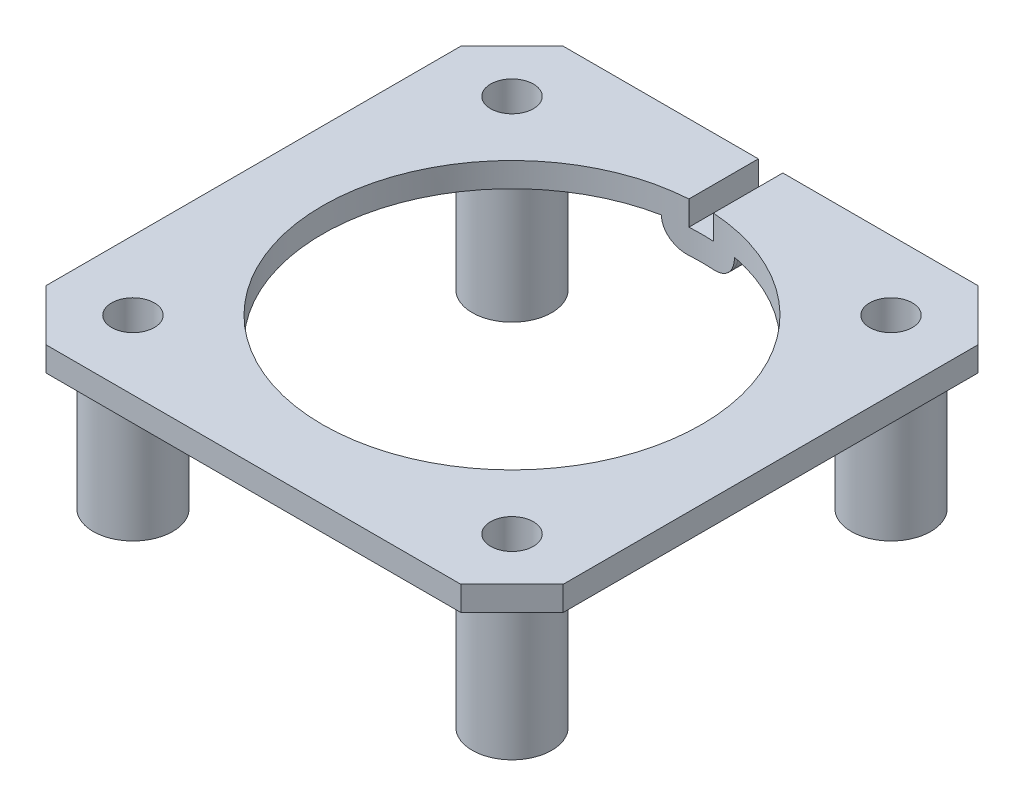
ISO-10303-21;
HEADER;
FILE_DESCRIPTION(('STEP AP214'),'2;1');
FILE_NAME('part.step','',(''),(''),'','','');
FILE_SCHEMA(('AUTOMOTIVE_DESIGN { 1 0 10303 214 1 1 1 1 }'));
ENDSEC;
DATA;
#1=APPLICATION_CONTEXT('core data for automotive mechanical design processes');
#2=APPLICATION_PROTOCOL_DEFINITION('international standard','automotive_design',2000,#1);
#3=PRODUCT_CONTEXT('',#1,'mechanical');
#4=PRODUCT('Part','Part','',(#3));
#5=PRODUCT_RELATED_PRODUCT_CATEGORY('part','',(#4));
#6=PRODUCT_DEFINITION_FORMATION('','',#4);
#7=PRODUCT_DEFINITION_CONTEXT('part definition',#1,'design');
#8=PRODUCT_DEFINITION('design','',#6,#7);
#9=PRODUCT_DEFINITION_SHAPE('','',#8);
#10=(LENGTH_UNIT() NAMED_UNIT(*) SI_UNIT(.MILLI.,.METRE.));
#11=(NAMED_UNIT(*) PLANE_ANGLE_UNIT() SI_UNIT($,.RADIAN.));
#12=(NAMED_UNIT(*) SI_UNIT($,.STERADIAN.) SOLID_ANGLE_UNIT());
#13=UNCERTAINTY_MEASURE_WITH_UNIT(LENGTH_MEASURE(1.E-05),#10,'distance_accuracy_value','');
#14=(GEOMETRIC_REPRESENTATION_CONTEXT(3) GLOBAL_UNCERTAINTY_ASSIGNED_CONTEXT((#13)) GLOBAL_UNIT_ASSIGNED_CONTEXT((#10,
#11,#12)) REPRESENTATION_CONTEXT('',''));
#15=CARTESIAN_POINT('',(0.,0.,0.));
#16=DIRECTION('',(0.,0.,1.));
#17=DIRECTION('',(1.,0.,0.));
#18=AXIS2_PLACEMENT_3D('',#15,#16,#17);
#19=CARTESIAN_POINT('',(0.,11.7,0.));
#20=DIRECTION('',(0.,1.,0.));
#21=DIRECTION('',(0.,0.,1.));
#22=AXIS2_PLACEMENT_3D('',#19,#20,#21);
#23=PLANE('',#22);
#24=CARTESIAN_POINT('',(-15.5,11.7,-15.5));
#25=DIRECTION('',(0.,1.,0.));
#26=DIRECTION('',(0.,0.,1.));
#27=AXIS2_PLACEMENT_3D('',#24,#25,#26);
#28=CIRCLE('',#27,3.25);
#29=CARTESIAN_POINT('',(-15.5,11.7,-12.25));
#30=VERTEX_POINT('',#29);
#31=EDGE_CURVE('E372',#30,#30,#28,.T.);
#32=ORIENTED_EDGE('',*,*,#31,.T.);
#33=EDGE_LOOP('',(#32));
#34=FACE_BOUND('',#33,.T.);
#35=CARTESIAN_POINT('',(15.5,11.7,-15.5));
#36=DIRECTION('',(0.,1.,0.));
#37=DIRECTION('',(0.,0.,1.));
#38=AXIS2_PLACEMENT_3D('',#35,#36,#37);
#39=CIRCLE('',#38,3.25);
#40=CARTESIAN_POINT('',(15.5,11.7,-12.25));
#41=VERTEX_POINT('',#40);
#42=EDGE_CURVE('E364',#41,#41,#39,.F.);
#43=ORIENTED_EDGE('',*,*,#42,.F.);
#44=EDGE_LOOP('',(#43));
#45=FACE_BOUND('',#44,.T.);
#46=CARTESIAN_POINT('',(-15.5,11.7,15.5));
#47=DIRECTION('',(0.,1.,0.));
#48=DIRECTION('',(0.,0.,1.));
#49=AXIS2_PLACEMENT_3D('',#46,#47,#48);
#50=CIRCLE('',#49,3.25);
#51=CARTESIAN_POINT('',(-15.5,11.7,18.75));
#52=VERTEX_POINT('',#51);
#53=EDGE_CURVE('E356',#52,#52,#50,.F.);
#54=ORIENTED_EDGE('',*,*,#53,.F.);
#55=EDGE_LOOP('',(#54));
#56=FACE_BOUND('',#55,.T.);
#57=CARTESIAN_POINT('',(15.5,11.7,15.5));
#58=DIRECTION('',(0.,1.,0.));
#59=DIRECTION('',(0.,0.,1.));
#60=AXIS2_PLACEMENT_3D('',#57,#58,#59);
#61=CIRCLE('',#60,3.25);
#62=CARTESIAN_POINT('',(15.5,11.7,18.75));
#63=VERTEX_POINT('',#62);
#64=EDGE_CURVE('E352',#63,#63,#61,.F.);
#65=ORIENTED_EDGE('',*,*,#64,.F.);
#66=EDGE_LOOP('',(#65));
#67=FACE_BOUND('',#66,.T.);
#68=DIRECTION('',(0.,0.,1.));
#69=VECTOR('',#68,1.);
#70=CARTESIAN_POINT('',(2.99999999999999,11.7,-21.15));
#71=LINE('',#70,#69);
#72=CARTESIAN_POINT('',(3.,11.7,-21.15));
#73=VERTEX_POINT('',#72);
#74=CARTESIAN_POINT('',(3.,11.7,-15.5));
#75=VERTEX_POINT('',#74);
#76=EDGE_CURVE('E235',#73,#75,#71,.T.);
#77=ORIENTED_EDGE('',*,*,#76,.F.);
#78=DIRECTION('',(-1.,0.,0.));
#79=VECTOR('',#78,1.);
#80=CARTESIAN_POINT('',(-21.15,11.7,-21.15));
#81=LINE('',#80,#79);
#82=CARTESIAN_POINT('',(16.9630555059549,11.7,-21.15));
#83=VERTEX_POINT('',#82);
#84=EDGE_CURVE('E387',#83,#73,#81,.T.);
#85=ORIENTED_EDGE('',*,*,#84,.F.);
#86=DIRECTION('',(-0.707106781186546,0.,-0.707106781186549));
#87=VECTOR('',#86,1.);
#88=CARTESIAN_POINT('',(19.0565277529775,11.7,-19.0565277529774));
#89=LINE('',#88,#87);
#90=CARTESIAN_POINT('',(21.15,11.7,-16.9630555059549));
#91=VERTEX_POINT('',#90);
#92=EDGE_CURVE('E300',#91,#83,#89,.T.);
#93=ORIENTED_EDGE('',*,*,#92,.F.);
#94=DIRECTION('',(0.,0.,-1.));
#95=VECTOR('',#94,1.);
#96=CARTESIAN_POINT('',(21.15,11.7,-21.15));
#97=LINE('',#96,#95);
#98=CARTESIAN_POINT('',(21.15,11.7,16.9630555059549));
#99=VERTEX_POINT('',#98);
#100=EDGE_CURVE('E381',#99,#91,#97,.T.);
#101=ORIENTED_EDGE('',*,*,#100,.F.);
#102=DIRECTION('',(-0.707106781186546,0.,0.707106781186549));
#103=VECTOR('',#102,1.);
#104=CARTESIAN_POINT('',(19.0565277529775,11.7,19.0565277529774));
#105=LINE('',#104,#103);
#106=CARTESIAN_POINT('',(16.9630555059549,11.7,21.15));
#107=VERTEX_POINT('',#106);
#108=EDGE_CURVE('E328',#99,#107,#105,.T.);
#109=ORIENTED_EDGE('',*,*,#108,.T.);
#110=DIRECTION('',(1.,0.,0.));
#111=VECTOR('',#110,1.);
#112=CARTESIAN_POINT('',(-21.15,11.7,21.15));
#113=LINE('',#112,#111);
#114=CARTESIAN_POINT('',(-16.9630555059549,11.7,21.15));
#115=VERTEX_POINT('',#114);
#116=EDGE_CURVE('E395',#115,#107,#113,.T.);
#117=ORIENTED_EDGE('',*,*,#116,.F.);
#118=DIRECTION('',(0.707106781186546,0.,0.707106781186549));
#119=VECTOR('',#118,1.);
#120=CARTESIAN_POINT('',(-19.0565277529775,11.7,19.0565277529774));
#121=LINE('',#120,#119);
#122=CARTESIAN_POINT('',(-21.15,11.7,16.9630555059549));
#123=VERTEX_POINT('',#122);
#124=EDGE_CURVE('E314',#123,#115,#121,.T.);
#125=ORIENTED_EDGE('',*,*,#124,.F.);
#126=DIRECTION('',(0.,0.,1.));
#127=VECTOR('',#126,1.);
#128=CARTESIAN_POINT('',(-21.15,11.7,-21.15));
#129=LINE('',#128,#127);
#130=CARTESIAN_POINT('',(-21.15,11.7,-16.9630555059549));
#131=VERTEX_POINT('',#130);
#132=EDGE_CURVE('E391',#131,#123,#129,.T.);
#133=ORIENTED_EDGE('',*,*,#132,.F.);
#134=DIRECTION('',(0.707106781186546,0.,-0.707106781186549));
#135=VECTOR('',#134,1.);
#136=CARTESIAN_POINT('',(-19.0565277529775,11.7,-19.0565277529774));
#137=LINE('',#136,#135);
#138=CARTESIAN_POINT('',(-16.9630555059549,11.7,-21.15));
#139=VERTEX_POINT('',#138);
#140=EDGE_CURVE('E343',#131,#139,#137,.T.);
#141=ORIENTED_EDGE('',*,*,#140,.T.);
#142=CARTESIAN_POINT('',(-3.,11.7,-21.15));
#143=VERTEX_POINT('',#142);
#144=EDGE_CURVE('E385',#143,#139,#81,.T.);
#145=ORIENTED_EDGE('',*,*,#144,.F.);
#146=DIRECTION('',(0.,0.,-1.));
#147=VECTOR('',#146,1.);
#148=CARTESIAN_POINT('',(-3.00000000000001,11.7,-21.15));
#149=LINE('',#148,#147);
#150=CARTESIAN_POINT('',(-3.,11.7,-15.5));
#151=VERTEX_POINT('',#150);
#152=EDGE_CURVE('E240',#151,#143,#149,.T.);
#153=ORIENTED_EDGE('',*,*,#152,.F.);
#154=CARTESIAN_POINT('',(0.,11.7,-15.5));
#155=DIRECTION('',(0.,-1.,0.));
#156=DIRECTION('',(0.,0.,-1.));
#157=AXIS2_PLACEMENT_3D('',#154,#155,#156);
#158=CIRCLE('',#157,3.);
#159=CARTESIAN_POINT('',(-2.98591908784674,11.7,-15.2096774193548));
#160=VERTEX_POINT('',#159);
#161=EDGE_CURVE('E252',#160,#151,#158,.T.);
#162=ORIENTED_EDGE('',*,*,#161,.F.);
#163=CARTESIAN_POINT('',(0.,11.7,0.));
#164=DIRECTION('',(0.,1.,0.));
#165=DIRECTION('',(0.,0.,1.));
#166=AXIS2_PLACEMENT_3D('',#163,#164,#165);
#167=CIRCLE('',#166,15.5);
#168=CARTESIAN_POINT('',(2.98591908784675,11.7,-15.2096774193548));
#169=VERTEX_POINT('',#168);
#170=EDGE_CURVE('E373',#160,#169,#167,.T.);
#171=ORIENTED_EDGE('',*,*,#170,.T.);
#172=CARTESIAN_POINT('',(0.,11.7,-15.5));
#173=DIRECTION('',(0.,-1.,0.));
#174=DIRECTION('',(0.,0.,-1.));
#175=AXIS2_PLACEMENT_3D('',#172,#173,#174);
#176=CIRCLE('',#175,3.);
#177=EDGE_CURVE('E248',#75,#169,#176,.T.);
#178=ORIENTED_EDGE('',*,*,#177,.F.);
#179=EDGE_LOOP('',(#77,#85,#93,#101,#109,#117,#125,#133,#141,#145,#153,#162,#171,#178));
#180=FACE_BOUND('',#179,.T.);
#181=ADVANCED_FACE('F39',(#34,#45,#56,#67,#180),#23,.F.);
#182=CARTESIAN_POINT('',(21.15,11.7,-21.15));
#183=DIRECTION('',(1.,0.,0.));
#184=DIRECTION('',(0.,0.,-1.));
#185=AXIS2_PLACEMENT_3D('',#182,#183,#184);
#186=PLANE('',#185);
#187=ORIENTED_EDGE('',*,*,#100,.T.);
#188=DIRECTION('',(0.,1.,0.));
#189=VECTOR('',#188,1.);
#190=CARTESIAN_POINT('',(21.15,0.,-16.9630555059549));
#191=LINE('',#190,#189);
#192=CARTESIAN_POINT('',(21.15,13.7,-16.9630555059549));
#193=VERTEX_POINT('',#192);
#194=EDGE_CURVE('E295',#91,#193,#191,.T.);
#195=ORIENTED_EDGE('',*,*,#194,.T.);
#196=DIRECTION('',(0.,0.,-1.));
#197=VECTOR('',#196,1.);
#198=CARTESIAN_POINT('',(21.15,13.7,-21.15));
#199=LINE('',#198,#197);
#200=CARTESIAN_POINT('',(21.15,13.7,16.9630555059549));
#201=VERTEX_POINT('',#200);
#202=EDGE_CURVE('E377',#201,#193,#199,.T.);
#203=ORIENTED_EDGE('',*,*,#202,.F.);
#204=DIRECTION('',(0.,1.,0.));
#205=VECTOR('',#204,1.);
#206=CARTESIAN_POINT('',(21.15,0.,16.9630555059549));
#207=LINE('',#206,#205);
#208=EDGE_CURVE('E334',#99,#201,#207,.T.);
#209=ORIENTED_EDGE('',*,*,#208,.F.);
#210=EDGE_LOOP('',(#187,#195,#203,#209));
#211=FACE_BOUND('',#210,.T.);
#212=ADVANCED_FACE('F470',(#211),#186,.T.);
#213=CARTESIAN_POINT('',(-21.15,11.7,21.15));
#214=DIRECTION('',(0.,0.,1.));
#215=DIRECTION('',(1.,0.,0.));
#216=AXIS2_PLACEMENT_3D('',#213,#214,#215);
#217=PLANE('',#216);
#218=DIRECTION('',(1.,0.,0.));
#219=VECTOR('',#218,1.);
#220=CARTESIAN_POINT('',(-21.15,13.7,21.15));
#221=LINE('',#220,#219);
#222=CARTESIAN_POINT('',(-16.9630555059549,13.7,21.15));
#223=VERTEX_POINT('',#222);
#224=CARTESIAN_POINT('',(16.9630555059549,13.7,21.15));
#225=VERTEX_POINT('',#224);
#226=EDGE_CURVE('E386',#223,#225,#221,.T.);
#227=ORIENTED_EDGE('',*,*,#226,.F.);
#228=DIRECTION('',(0.,1.,0.));
#229=VECTOR('',#228,1.);
#230=CARTESIAN_POINT('',(-16.9630555059549,0.,21.15));
#231=LINE('',#230,#229);
#232=EDGE_CURVE('E294',#115,#223,#231,.T.);
#233=ORIENTED_EDGE('',*,*,#232,.F.);
#234=ORIENTED_EDGE('',*,*,#116,.T.);
#235=DIRECTION('',(0.,1.,0.));
#236=VECTOR('',#235,1.);
#237=CARTESIAN_POINT('',(16.9630555059549,0.,21.15));
#238=LINE('',#237,#236);
#239=EDGE_CURVE('E323',#107,#225,#238,.T.);
#240=ORIENTED_EDGE('',*,*,#239,.T.);
#241=EDGE_LOOP('',(#227,#233,#234,#240));
#242=FACE_BOUND('',#241,.T.);
#243=ADVANCED_FACE('F472',(#242),#217,.T.);
#244=CARTESIAN_POINT('',(-21.15,11.7,-21.15));
#245=DIRECTION('',(-1.,0.,0.));
#246=DIRECTION('',(0.,0.,1.));
#247=AXIS2_PLACEMENT_3D('',#244,#245,#246);
#248=PLANE('',#247);
#249=ORIENTED_EDGE('',*,*,#132,.T.);
#250=DIRECTION('',(0.,1.,0.));
#251=VECTOR('',#250,1.);
#252=CARTESIAN_POINT('',(-21.15,0.,16.9630555059549));
#253=LINE('',#252,#251);
#254=CARTESIAN_POINT('',(-21.15,13.7,16.9630555059549));
#255=VERTEX_POINT('',#254);
#256=EDGE_CURVE('E296',#123,#255,#253,.T.);
#257=ORIENTED_EDGE('',*,*,#256,.T.);
#258=DIRECTION('',(0.,0.,1.));
#259=VECTOR('',#258,1.);
#260=CARTESIAN_POINT('',(-21.15,13.7,-21.15));
#261=LINE('',#260,#259);
#262=CARTESIAN_POINT('',(-21.15,13.7,-16.9630555059549));
#263=VERTEX_POINT('',#262);
#264=EDGE_CURVE('E407',#263,#255,#261,.T.);
#265=ORIENTED_EDGE('',*,*,#264,.F.);
#266=DIRECTION('',(0.,1.,0.));
#267=VECTOR('',#266,1.);
#268=CARTESIAN_POINT('',(-21.15,0.,-16.9630555059549));
#269=LINE('',#268,#267);
#270=EDGE_CURVE('E322',#131,#263,#269,.T.);
#271=ORIENTED_EDGE('',*,*,#270,.F.);
#272=EDGE_LOOP('',(#249,#257,#265,#271));
#273=FACE_BOUND('',#272,.T.);
#274=ADVANCED_FACE('F475',(#273),#248,.T.);
#275=CARTESIAN_POINT('',(-21.15,11.7,-21.15));
#276=DIRECTION('',(0.,0.,-1.));
#277=DIRECTION('',(-1.,0.,0.));
#278=AXIS2_PLACEMENT_3D('',#275,#276,#277);
#279=PLANE('',#278);
#280=ORIENTED_EDGE('',*,*,#84,.T.);
#281=CARTESIAN_POINT('',(0.999999999999995,11.7,-21.15));
#282=DIRECTION('',(0.,0.,-1.));
#283=DIRECTION('',(-1.,0.,0.));
#284=AXIS2_PLACEMENT_3D('',#281,#282,#283);
#285=CIRCLE('',#284,2.);
#286=CARTESIAN_POINT('',(0.999999999999995,9.7,-21.15));
#287=VERTEX_POINT('',#286);
#288=EDGE_CURVE('E11',#73,#287,#285,.T.);
#289=ORIENTED_EDGE('',*,*,#288,.T.);
#290=DIRECTION('',(1.,0.,0.));
#291=VECTOR('',#290,1.);
#292=CARTESIAN_POINT('',(2.99999999999999,9.7,-21.15));
#293=LINE('',#292,#291);
#294=CARTESIAN_POINT('',(-1.00000000000001,9.7,-21.15));
#295=VERTEX_POINT('',#294);
#296=EDGE_CURVE('E236',#295,#287,#293,.T.);
#297=ORIENTED_EDGE('',*,*,#296,.F.);
#298=CARTESIAN_POINT('',(-1.00000000000001,11.7,-21.15));
#299=DIRECTION('',(0.,0.,-1.));
#300=DIRECTION('',(-1.,0.,0.));
#301=AXIS2_PLACEMENT_3D('',#298,#299,#300);
#302=CIRCLE('',#301,2.);
#303=EDGE_CURVE('E49',#295,#143,#302,.T.);
#304=ORIENTED_EDGE('',*,*,#303,.T.);
#305=ORIENTED_EDGE('',*,*,#144,.T.);
#306=DIRECTION('',(0.,1.,0.));
#307=VECTOR('',#306,1.);
#308=CARTESIAN_POINT('',(-16.9630555059549,0.,-21.15));
#309=LINE('',#308,#307);
#310=CARTESIAN_POINT('',(-16.9630555059549,13.7,-21.15));
#311=VERTEX_POINT('',#310);
#312=EDGE_CURVE('E324',#139,#311,#309,.T.);
#313=ORIENTED_EDGE('',*,*,#312,.T.);
#314=DIRECTION('',(-1.,0.,0.));
#315=VECTOR('',#314,1.);
#316=CARTESIAN_POINT('',(-21.15,13.7,-21.15));
#317=LINE('',#316,#315);
#318=CARTESIAN_POINT('',(-1.,13.7,-21.15));
#319=VERTEX_POINT('',#318);
#320=EDGE_CURVE('E402',#319,#311,#317,.T.);
#321=ORIENTED_EDGE('',*,*,#320,.F.);
#322=DIRECTION('',(0.,1.,0.));
#323=VECTOR('',#322,1.);
#324=CARTESIAN_POINT('',(-1.,11.7,-21.15));
#325=LINE('',#324,#323);
#326=CARTESIAN_POINT('',(-1.,11.7,-21.15));
#327=VERTEX_POINT('',#326);
#328=EDGE_CURVE('E228',#327,#319,#325,.T.);
#329=ORIENTED_EDGE('',*,*,#328,.F.);
#330=DIRECTION('',(1.,0.,0.));
#331=VECTOR('',#330,1.);
#332=CARTESIAN_POINT('',(-21.15,11.7,-21.15));
#333=LINE('',#332,#331);
#334=CARTESIAN_POINT('',(1.00000000000002,11.7,-21.15));
#335=VERTEX_POINT('',#334);
#336=EDGE_CURVE('E227',#327,#335,#333,.T.);
#337=ORIENTED_EDGE('',*,*,#336,.T.);
#338=DIRECTION('',(0.,1.,0.));
#339=VECTOR('',#338,1.);
#340=CARTESIAN_POINT('',(1.00000000000002,11.7,-21.15));
#341=LINE('',#340,#339);
#342=CARTESIAN_POINT('',(1.00000000000002,13.7,-21.15));
#343=VERTEX_POINT('',#342);
#344=EDGE_CURVE('E204',#335,#343,#341,.T.);
#345=ORIENTED_EDGE('',*,*,#344,.T.);
#346=CARTESIAN_POINT('',(16.9630555059549,13.7,-21.15));
#347=VERTEX_POINT('',#346);
#348=EDGE_CURVE('E403',#347,#343,#317,.T.);
#349=ORIENTED_EDGE('',*,*,#348,.F.);
#350=DIRECTION('',(0.,1.,0.));
#351=VECTOR('',#350,1.);
#352=CARTESIAN_POINT('',(16.9630555059549,0.,-21.15));
#353=LINE('',#352,#351);
#354=EDGE_CURVE('E306',#83,#347,#353,.T.);
#355=ORIENTED_EDGE('',*,*,#354,.F.);
#356=EDGE_LOOP('',(#280,#289,#297,#304,#305,#313,#321,#329,#337,#345,#349,#355));
#357=FACE_BOUND('',#356,.T.);
#358=ADVANCED_FACE('F479',(#357),#279,.T.);
#359=CARTESIAN_POINT('',(-15.5,13.7,-15.5));
#360=DIRECTION('',(0.,1.,0.));
#361=DIRECTION('',(0.,0.,1.));
#362=AXIS2_PLACEMENT_3D('',#359,#360,#361);
#363=PLANE('',#362);
#364=CARTESIAN_POINT('',(0.,13.7,-15.5));
#365=DIRECTION('',(0.,1.,0.));
#366=DIRECTION('',(0.,0.,1.));
#367=AXIS2_PLACEMENT_3D('',#364,#365,#366);
#368=CIRCLE('',#367,1.);
#369=CARTESIAN_POINT('',(-1.,13.7,-15.5));
#370=VERTEX_POINT('',#369);
#371=CARTESIAN_POINT('',(-0.999479573214817,13.7,-15.4677419354839));
#372=VERTEX_POINT('',#371);
#373=EDGE_CURVE('E215',#370,#372,#368,.T.);
#374=ORIENTED_EDGE('',*,*,#373,.F.);
#375=DIRECTION('',(0.,0.,1.));
#376=VECTOR('',#375,1.);
#377=CARTESIAN_POINT('',(-1.,13.7,-15.5));
#378=LINE('',#377,#376);
#379=EDGE_CURVE('E194',#319,#370,#378,.T.);
#380=ORIENTED_EDGE('',*,*,#379,.F.);
#381=ORIENTED_EDGE('',*,*,#320,.T.);
#382=DIRECTION('',(0.707106781186546,0.,-0.707106781186549));
#383=VECTOR('',#382,1.);
#384=CARTESIAN_POINT('',(-16.9630555059549,13.7,-21.15));
#385=LINE('',#384,#383);
#386=EDGE_CURVE('E318',#263,#311,#385,.T.);
#387=ORIENTED_EDGE('',*,*,#386,.F.);
#388=ORIENTED_EDGE('',*,*,#264,.T.);
#389=DIRECTION('',(0.707106781186546,0.,0.707106781186549));
#390=VECTOR('',#389,1.);
#391=CARTESIAN_POINT('',(-16.9630555059549,13.7,21.15));
#392=LINE('',#391,#390);
#393=EDGE_CURVE('E290',#255,#223,#392,.T.);
#394=ORIENTED_EDGE('',*,*,#393,.T.);
#395=ORIENTED_EDGE('',*,*,#226,.T.);
#396=DIRECTION('',(-0.707106781186546,0.,0.707106781186549));
#397=VECTOR('',#396,1.);
#398=CARTESIAN_POINT('',(16.9630555059549,13.7,21.15));
#399=LINE('',#398,#397);
#400=EDGE_CURVE('E317',#201,#225,#399,.T.);
#401=ORIENTED_EDGE('',*,*,#400,.F.);
#402=ORIENTED_EDGE('',*,*,#202,.T.);
#403=DIRECTION('',(-0.707106781186546,0.,-0.707106781186549));
#404=VECTOR('',#403,1.);
#405=CARTESIAN_POINT('',(16.9630555059549,13.7,-21.15));
#406=LINE('',#405,#404);
#407=EDGE_CURVE('E286',#193,#347,#406,.T.);
#408=ORIENTED_EDGE('',*,*,#407,.T.);
#409=ORIENTED_EDGE('',*,*,#348,.T.);
#410=DIRECTION('',(0.,0.,-1.));
#411=VECTOR('',#410,1.);
#412=CARTESIAN_POINT('',(1.,13.7,-15.5));
#413=LINE('',#412,#411);
#414=CARTESIAN_POINT('',(1.,13.7,-15.5));
#415=VERTEX_POINT('',#414);
#416=EDGE_CURVE('E218',#415,#343,#413,.T.);
#417=ORIENTED_EDGE('',*,*,#416,.F.);
#418=CARTESIAN_POINT('',(0.999479573214817,13.7,-15.4677419354839));
#419=VERTEX_POINT('',#418);
#420=EDGE_CURVE('E200',#419,#415,#368,.T.);
#421=ORIENTED_EDGE('',*,*,#420,.F.);
#422=CARTESIAN_POINT('',(0.,13.7,0.));
#423=DIRECTION('',(0.,1.,0.));
#424=DIRECTION('',(0.,0.,1.));
#425=AXIS2_PLACEMENT_3D('',#422,#423,#424);
#426=CIRCLE('',#425,15.5);
#427=EDGE_CURVE('E368',#372,#419,#426,.T.);
#428=ORIENTED_EDGE('',*,*,#427,.F.);
#429=EDGE_LOOP('',(#374,#380,#381,#387,#388,#394,#395,#401,#402,#408,#409,#417,#421,#428));
#430=FACE_BOUND('',#429,.T.);
#431=CARTESIAN_POINT('',(15.5,13.7,15.5));
#432=DIRECTION('',(0.,1.,0.));
#433=DIRECTION('',(0.,0.,1.));
#434=AXIS2_PLACEMENT_3D('',#431,#432,#433);
#435=CIRCLE('',#434,1.75);
#436=CARTESIAN_POINT('',(15.5,13.7,17.25));
#437=VERTEX_POINT('',#436);
#438=EDGE_CURVE('E258',#437,#437,#435,.T.);
#439=ORIENTED_EDGE('',*,*,#438,.F.);
#440=EDGE_LOOP('',(#439));
#441=FACE_BOUND('',#440,.T.);
#442=CARTESIAN_POINT('',(-15.5,13.7,15.5));
#443=DIRECTION('',(0.,-1.,0.));
#444=DIRECTION('',(0.,0.,1.));
#445=AXIS2_PLACEMENT_3D('',#442,#443,#444);
#446=CIRCLE('',#445,1.75);
#447=CARTESIAN_POINT('',(-15.5,13.7,17.25));
#448=VERTEX_POINT('',#447);
#449=EDGE_CURVE('E266',#448,#448,#446,.T.);
#450=ORIENTED_EDGE('',*,*,#449,.T.);
#451=EDGE_LOOP('',(#450));
#452=FACE_BOUND('',#451,.T.);
#453=CARTESIAN_POINT('',(-15.5,13.7,-15.5));
#454=DIRECTION('',(0.,1.,0.));
#455=DIRECTION('',(0.,0.,-1.));
#456=AXIS2_PLACEMENT_3D('',#453,#454,#455);
#457=CIRCLE('',#456,1.75);
#458=CARTESIAN_POINT('',(-15.5,13.7,-17.25));
#459=VERTEX_POINT('',#458);
#460=EDGE_CURVE('E274',#459,#459,#457,.T.);
#461=ORIENTED_EDGE('',*,*,#460,.F.);
#462=EDGE_LOOP('',(#461));
#463=FACE_BOUND('',#462,.T.);
#464=CARTESIAN_POINT('',(15.5,13.7,-15.5));
#465=DIRECTION('',(0.,-1.,0.));
#466=DIRECTION('',(0.,0.,-1.));
#467=AXIS2_PLACEMENT_3D('',#464,#465,#466);
#468=CIRCLE('',#467,1.75);
#469=CARTESIAN_POINT('',(15.5,13.7,-17.25));
#470=VERTEX_POINT('',#469);
#471=EDGE_CURVE('E282',#470,#470,#468,.T.);
#472=ORIENTED_EDGE('',*,*,#471,.T.);
#473=EDGE_LOOP('',(#472));
#474=FACE_BOUND('',#473,.T.);
#475=ADVANCED_FACE('F483',(#430,#441,#452,#463,#474),#363,.T.);
#476=CARTESIAN_POINT('',(-15.5,13.7,-15.5));
#477=DIRECTION('',(0.,-1.,0.));
#478=DIRECTION('',(0.,0.,-1.));
#479=AXIS2_PLACEMENT_3D('',#476,#477,#478);
#480=CYLINDRICAL_SURFACE('',#479,3.25);
#481=CARTESIAN_POINT('',(-15.5,0.,-15.5));
#482=DIRECTION('',(0.,1.,0.));
#483=DIRECTION('',(0.,0.,1.));
#484=AXIS2_PLACEMENT_3D('',#481,#482,#483);
#485=CIRCLE('',#484,3.25);
#486=CARTESIAN_POINT('',(-15.5,0.,-12.25));
#487=VERTEX_POINT('',#486);
#488=EDGE_CURVE('E398',#487,#487,#485,.T.);
#489=ORIENTED_EDGE('',*,*,#488,.T.);
#490=EDGE_LOOP('',(#489));
#491=FACE_BOUND('',#490,.T.);
#492=ORIENTED_EDGE('',*,*,#31,.F.);
#493=EDGE_LOOP('',(#492));
#494=FACE_BOUND('',#493,.T.);
#495=ADVANCED_FACE('F490',(#491,#494),#480,.T.);
#496=CARTESIAN_POINT('',(-15.5,0.,-15.5));
#497=DIRECTION('',(0.,1.,0.));
#498=DIRECTION('',(0.,0.,1.));
#499=AXIS2_PLACEMENT_3D('',#496,#497,#498);
#500=PLANE('',#499);
#501=CARTESIAN_POINT('',(-15.5,0.,-15.5));
#502=DIRECTION('',(0.,1.,0.));
#503=DIRECTION('',(0.,0.,-1.));
#504=AXIS2_PLACEMENT_3D('',#501,#502,#503);
#505=CIRCLE('',#504,1.75);
#506=CARTESIAN_POINT('',(-15.5,0.,-17.25));
#507=VERTEX_POINT('',#506);
#508=EDGE_CURVE('E270',#507,#507,#505,.T.);
#509=ORIENTED_EDGE('',*,*,#508,.T.);
#510=EDGE_LOOP('',(#509));
#511=FACE_BOUND('',#510,.T.);
#512=ORIENTED_EDGE('',*,*,#488,.F.);
#513=EDGE_LOOP('',(#512));
#514=FACE_BOUND('',#513,.T.);
#515=ADVANCED_FACE('F464',(#511,#514),#500,.F.);
#516=CARTESIAN_POINT('',(0.,11.7,0.));
#517=DIRECTION('',(0.,1.,0.));
#518=DIRECTION('',(0.,0.,1.));
#519=AXIS2_PLACEMENT_3D('',#516,#517,#518);
#520=CYLINDRICAL_SURFACE('',#519,15.5);
#521=CARTESIAN_POINT('',(0.,9.7,0.));
#522=DIRECTION('',(0.,1.,0.));
#523=DIRECTION('',(0.,0.,-1.));
#524=AXIS2_PLACEMENT_3D('',#521,#522,#523);
#525=CIRCLE('',#524,15.5);
#526=CARTESIAN_POINT('',(0.999479573214817,9.7,-15.4677419354839));
#527=VERTEX_POINT('',#526);
#528=CARTESIAN_POINT('',(-0.999479573214817,9.7,-15.4677419354839));
#529=VERTEX_POINT('',#528);
#530=EDGE_CURVE('E239',#527,#529,#525,.T.);
#531=ORIENTED_EDGE('',*,*,#530,.F.);
#532=CARTESIAN_POINT('',(0.999479573214817,9.7,-15.4677419354839));
#533=CARTESIAN_POINT('',(1.05530137664857,9.700000359105,-15.4641365751976));
#534=CARTESIAN_POINT('',(1.11107648691223,9.70234580672232,-15.4602270480233));
#535=CARTESIAN_POINT('',(1.22218718399216,9.71170028391383,-15.4518398618925));
#536=CARTESIAN_POINT('',(1.27752280173724,9.71870898232079,-15.4473622432981));
#537=CARTESIAN_POINT('',(1.44216035721751,9.74665613645632,-15.4331542130122));
#538=CARTESIAN_POINT('',(1.55030157763586,9.7745158791173,-15.4226350197211));
#539=CARTESIAN_POINT('',(1.76028198767349,9.84792996513215,-15.4000844665477));
#540=CARTESIAN_POINT('',(1.86211525676461,9.89350064841327,-15.3880517172283));
#541=CARTESIAN_POINT('',(2.05661684811339,10.0010528454933,-15.3632659568107));
#542=CARTESIAN_POINT('',(2.14928602326489,10.0630328301156,-15.3505130129142));
#543=CARTESIAN_POINT('',(2.32332356446978,10.202005888297,-15.3251412393192));
#544=CARTESIAN_POINT('',(2.40463719570148,10.2790676489274,-15.3125233127929));
#545=CARTESIAN_POINT('',(2.55323825553026,10.4458854100337,-15.2884484204341));
#546=CARTESIAN_POINT('',(2.6205230617176,10.5356437786339,-15.276991671866));
#547=CARTESIAN_POINT('',(2.73933848705723,10.7255385367597,-15.2561359809131));
#548=CARTESIAN_POINT('',(2.79083290612261,10.8256980785993,-15.2467417807875));
#549=CARTESIAN_POINT('',(2.87642026710495,11.0333813123625,-15.230827700009));
#550=CARTESIAN_POINT('',(2.91052323691986,11.1409007199322,-15.2243061632764));
#551=CARTESIAN_POINT('',(2.95222896235426,11.3241912637067,-15.216262244469));
#552=CARTESIAN_POINT('',(2.96485375008179,11.3988188077042,-15.2138019455587));
#553=CARTESIAN_POINT('',(2.98169862263606,11.5489536099163,-15.210506017278));
#554=CARTESIAN_POINT('',(2.98592956472498,11.6244596044735,-15.2096682891799));
#555=CARTESIAN_POINT('',(2.98591908784674,11.7,-15.2096774193548));
#556=B_SPLINE_CURVE_WITH_KNOTS('',3,(#532,#533,#534,#535,#536,#537,#538,#539,#540,#541,#542,
#543,#544,#545,#546,#547,#548,#549,#550,#551,#552,#553,#554,#555),.UNSPECIFIED.,.F.,.F.,(4,2,2,
2,2,2,2,2,2,2,2,4),(0.,0.167710928986929,0.335409949020613,0.670188903399668,1.00527745732751,
1.34033479546205,1.67695517221807,2.01363841715282,2.35108784854677,2.68834248620357,
2.91506760565953,3.14149926925766),.UNSPECIFIED.);
#557=EDGE_CURVE('E448',#527,#169,#556,.T.);
#558=ORIENTED_EDGE('',*,*,#557,.T.);
#559=ORIENTED_EDGE('',*,*,#170,.F.);
#560=CARTESIAN_POINT('',(-2.98591908784674,11.7,-15.2096774193548));
#561=CARTESIAN_POINT('',(-2.98591861022796,11.643888224858,-15.2096757157221));
#562=CARTESIAN_POINT('',(-2.98358955152069,11.5878034385544,-15.210134947606));
#563=CARTESIAN_POINT('',(-2.9742973149712,11.4760374124605,-15.211955448884));
#564=CARTESIAN_POINT('',(-2.96733442747669,11.4203561476073,-15.2133166617614));
#565=CARTESIAN_POINT('',(-2.939562864668,11.2546325843704,-15.2187170558968));
#566=CARTESIAN_POINT('',(-2.91187109017694,11.1457038587454,-15.2240731363927));
#567=CARTESIAN_POINT('',(-2.83887834837235,10.9341348878108,-15.2378519649681));
#568=CARTESIAN_POINT('',(-2.79357005759786,10.8314972783859,-15.246275988347));
#569=CARTESIAN_POINT('',(-2.68658756744161,10.6353826155849,-15.2654901422363));
#570=CARTESIAN_POINT('',(-2.62491529755607,10.541904483982,-15.2762799937632));
#571=CARTESIAN_POINT('',(-2.48671651939834,10.3665062757558,-15.2993838604485));
#572=CARTESIAN_POINT('',(-2.41015398231509,10.2846150825187,-15.3117015456601));
#573=CARTESIAN_POINT('',(-2.24434946413731,10.1349309035543,-15.3368807651545));
#574=CARTESIAN_POINT('',(-2.15510499773539,10.0671406876595,-15.3497424056898));
#575=CARTESIAN_POINT('',(-1.96624338939539,9.94746966810037,-15.3750763483892));
#576=CARTESIAN_POINT('',(-1.86660734699437,9.89561855533635,-15.3875478855425));
#577=CARTESIAN_POINT('',(-1.65989706507754,9.80948820489135,-15.4112145360459));
#578=CARTESIAN_POINT('',(-1.55282738265697,9.7751983076819,-15.4224104204908));
#579=CARTESIAN_POINT('',(-1.37085966449436,9.73350849048644,-15.439433081493));
#580=CARTESIAN_POINT('',(-1.29715199432452,9.72095343173957,-15.4458046312051));
#581=CARTESIAN_POINT('',(-1.1488121587499,9.70419940590265,-15.457548895925));
#582=CARTESIAN_POINT('',(-1.07418131250204,9.69998965122266,-15.4629228922641));
#583=CARTESIAN_POINT('',(-0.999479573214817,9.7,-15.4677419354839));
#584=B_SPLINE_CURVE_WITH_KNOTS('',3,(#560,#561,#562,#563,#564,#565,#566,#567,#568,#569,#570,
#571,#572,#573,#574,#575,#576,#577,#578,#579,#580,#581,#582,#583),.UNSPECIFIED.,.F.,.F.,(4,2,2,
2,2,2,2,2,2,2,2,4),(0.,0.168231580117249,0.336452620126111,0.672282640471046,1.00825242012703,
1.34418260277766,1.68093595553509,2.01775539388131,2.35519850000139,2.69243653715522,
2.9171105579431,3.14149396310686),.UNSPECIFIED.);
#585=EDGE_CURVE('E440',#160,#529,#584,.T.);
#586=ORIENTED_EDGE('',*,*,#585,.T.);
#587=EDGE_LOOP('',(#531,#558,#559,#586));
#588=FACE_BOUND('',#587,.T.);
#589=CARTESIAN_POINT('',(0.,11.7,0.));
#590=DIRECTION('',(0.,1.,0.));
#591=DIRECTION('',(0.,0.,1.));
#592=AXIS2_PLACEMENT_3D('',#589,#590,#591);
#593=CIRCLE('',#592,15.5);
#594=CARTESIAN_POINT('',(-0.999479573214817,11.7,-15.4677419354839));
#595=VERTEX_POINT('',#594);
#596=CARTESIAN_POINT('',(0.999479573214817,11.7,-15.4677419354839));
#597=VERTEX_POINT('',#596);
#598=EDGE_CURVE('E189',#595,#597,#593,.F.);
#599=ORIENTED_EDGE('',*,*,#598,.F.);
#600=DIRECTION('',(0.,1.,0.));
#601=VECTOR('',#600,1.);
#602=CARTESIAN_POINT('',(-0.999479573214817,12.7,-15.4677419354839));
#603=LINE('',#602,#601);
#604=EDGE_CURVE('E424',#595,#372,#603,.T.);
#605=ORIENTED_EDGE('',*,*,#604,.T.);
#606=ORIENTED_EDGE('',*,*,#427,.T.);
#607=DIRECTION('',(0.,1.,0.));
#608=VECTOR('',#607,1.);
#609=CARTESIAN_POINT('',(0.999479573214817,12.7,-15.4677419354839));
#610=LINE('',#609,#608);
#611=EDGE_CURVE('E421',#419,#597,#610,.F.);
#612=ORIENTED_EDGE('',*,*,#611,.T.);
#613=EDGE_LOOP('',(#599,#605,#606,#612));
#614=FACE_BOUND('',#613,.T.);
#615=ADVANCED_FACE('F458',(#588,#614),#520,.F.);
#616=CARTESIAN_POINT('',(15.5,13.7,-15.5));
#617=DIRECTION('',(0.,-1.,0.));
#618=DIRECTION('',(0.,0.,-1.));
#619=AXIS2_PLACEMENT_3D('',#616,#617,#618);
#620=CYLINDRICAL_SURFACE('',#619,3.25);
#621=CARTESIAN_POINT('',(15.5,0.,-15.5));
#622=DIRECTION('',(0.,-1.,0.));
#623=DIRECTION('',(0.,0.,1.));
#624=AXIS2_PLACEMENT_3D('',#621,#622,#623);
#625=CIRCLE('',#624,3.25);
#626=CARTESIAN_POINT('',(15.5,0.,-12.25));
#627=VERTEX_POINT('',#626);
#628=EDGE_CURVE('E360',#627,#627,#625,.T.);
#629=ORIENTED_EDGE('',*,*,#628,.F.);
#630=EDGE_LOOP('',(#629));
#631=FACE_BOUND('',#630,.T.);
#632=ORIENTED_EDGE('',*,*,#42,.T.);
#633=EDGE_LOOP('',(#632));
#634=FACE_BOUND('',#633,.T.);
#635=ADVANCED_FACE('F463',(#631,#634),#620,.T.);
#636=CARTESIAN_POINT('',(15.5,0.,-15.5));
#637=DIRECTION('',(0.,1.,0.));
#638=DIRECTION('',(0.,0.,1.));
#639=AXIS2_PLACEMENT_3D('',#636,#637,#638);
#640=PLANE('',#639);
#641=CARTESIAN_POINT('',(15.5,0.,-15.5));
#642=DIRECTION('',(0.,-1.,0.));
#643=DIRECTION('',(0.,0.,-1.));
#644=AXIS2_PLACEMENT_3D('',#641,#642,#643);
#645=CIRCLE('',#644,1.75);
#646=CARTESIAN_POINT('',(15.5,0.,-17.25));
#647=VERTEX_POINT('',#646);
#648=EDGE_CURVE('E278',#647,#647,#645,.T.);
#649=ORIENTED_EDGE('',*,*,#648,.F.);
#650=EDGE_LOOP('',(#649));
#651=FACE_BOUND('',#650,.T.);
#652=ORIENTED_EDGE('',*,*,#628,.T.);
#653=EDGE_LOOP('',(#652));
#654=FACE_BOUND('',#653,.T.);
#655=ADVANCED_FACE('F617',(#651,#654),#640,.F.);
#656=CARTESIAN_POINT('',(-15.5,13.7,15.5));
#657=DIRECTION('',(0.,-1.,0.));
#658=DIRECTION('',(0.,0.,1.));
#659=AXIS2_PLACEMENT_3D('',#656,#657,#658);
#660=CYLINDRICAL_SURFACE('',#659,3.25);
#661=CARTESIAN_POINT('',(-15.5,0.,15.5));
#662=DIRECTION('',(0.,-1.,0.));
#663=DIRECTION('',(0.,0.,-1.));
#664=AXIS2_PLACEMENT_3D('',#661,#662,#663);
#665=CIRCLE('',#664,3.25);
#666=CARTESIAN_POINT('',(-15.5,0.,12.25));
#667=VERTEX_POINT('',#666);
#668=EDGE_CURVE('E351',#667,#667,#665,.T.);
#669=ORIENTED_EDGE('',*,*,#668,.F.);
#670=EDGE_LOOP('',(#669));
#671=FACE_BOUND('',#670,.T.);
#672=ORIENTED_EDGE('',*,*,#53,.T.);
#673=EDGE_LOOP('',(#672));
#674=FACE_BOUND('',#673,.T.);
#675=ADVANCED_FACE('F614',(#671,#674),#660,.T.);
#676=CARTESIAN_POINT('',(-15.5,0.,15.5));
#677=DIRECTION('',(0.,1.,0.));
#678=DIRECTION('',(0.,0.,-1.));
#679=AXIS2_PLACEMENT_3D('',#676,#677,#678);
#680=PLANE('',#679);
#681=CARTESIAN_POINT('',(-15.5,0.,15.5));
#682=DIRECTION('',(0.,-1.,0.));
#683=DIRECTION('',(0.,0.,1.));
#684=AXIS2_PLACEMENT_3D('',#681,#682,#683);
#685=CIRCLE('',#684,1.75);
#686=CARTESIAN_POINT('',(-15.5,0.,17.25));
#687=VERTEX_POINT('',#686);
#688=EDGE_CURVE('E262',#687,#687,#685,.T.);
#689=ORIENTED_EDGE('',*,*,#688,.F.);
#690=EDGE_LOOP('',(#689));
#691=FACE_BOUND('',#690,.T.);
#692=ORIENTED_EDGE('',*,*,#668,.T.);
#693=EDGE_LOOP('',(#692));
#694=FACE_BOUND('',#693,.T.);
#695=ADVANCED_FACE('F610',(#691,#694),#680,.F.);
#696=CARTESIAN_POINT('',(15.5,13.7,15.5));
#697=DIRECTION('',(0.,-1.,0.));
#698=DIRECTION('',(0.,0.,1.));
#699=AXIS2_PLACEMENT_3D('',#696,#697,#698);
#700=CYLINDRICAL_SURFACE('',#699,3.25);
#701=CARTESIAN_POINT('',(15.5,0.,15.5));
#702=DIRECTION('',(0.,1.,0.));
#703=DIRECTION('',(0.,0.,-1.));
#704=AXIS2_PLACEMENT_3D('',#701,#702,#703);
#705=CIRCLE('',#704,3.25);
#706=CARTESIAN_POINT('',(15.5,0.,12.25));
#707=VERTEX_POINT('',#706);
#708=EDGE_CURVE('E347',#707,#707,#705,.T.);
#709=ORIENTED_EDGE('',*,*,#708,.T.);
#710=EDGE_LOOP('',(#709));
#711=FACE_BOUND('',#710,.T.);
#712=ORIENTED_EDGE('',*,*,#64,.T.);
#713=EDGE_LOOP('',(#712));
#714=FACE_BOUND('',#713,.T.);
#715=ADVANCED_FACE('F606',(#711,#714),#700,.T.);
#716=CARTESIAN_POINT('',(15.5,0.,15.5));
#717=DIRECTION('',(0.,1.,0.));
#718=DIRECTION('',(0.,0.,-1.));
#719=AXIS2_PLACEMENT_3D('',#716,#717,#718);
#720=PLANE('',#719);
#721=CARTESIAN_POINT('',(15.5,0.,15.5));
#722=DIRECTION('',(0.,1.,0.));
#723=DIRECTION('',(0.,0.,1.));
#724=AXIS2_PLACEMENT_3D('',#721,#722,#723);
#725=CIRCLE('',#724,1.75);
#726=CARTESIAN_POINT('',(15.5,0.,17.25));
#727=VERTEX_POINT('',#726);
#728=EDGE_CURVE('E244',#727,#727,#725,.T.);
#729=ORIENTED_EDGE('',*,*,#728,.T.);
#730=EDGE_LOOP('',(#729));
#731=FACE_BOUND('',#730,.T.);
#732=ORIENTED_EDGE('',*,*,#708,.F.);
#733=EDGE_LOOP('',(#732));
#734=FACE_BOUND('',#733,.T.);
#735=ADVANCED_FACE('F603',(#731,#734),#720,.F.);
#736=CARTESIAN_POINT('',(16.9630555059549,0.,21.15));
#737=DIRECTION('',(-0.707106781186549,0.,-0.707106781186546));
#738=DIRECTION('',(-0.707106781186546,0.,0.707106781186549));
#739=AXIS2_PLACEMENT_3D('',#736,#737,#738);
#740=PLANE('',#739);
#741=ORIENTED_EDGE('',*,*,#208,.T.);
#742=ORIENTED_EDGE('',*,*,#400,.T.);
#743=ORIENTED_EDGE('',*,*,#239,.F.);
#744=ORIENTED_EDGE('',*,*,#108,.F.);
#745=EDGE_LOOP('',(#741,#742,#743,#744));
#746=FACE_BOUND('',#745,.T.);
#747=ADVANCED_FACE('F554',(#746),#740,.F.);
#748=CARTESIAN_POINT('',(-16.9630555059549,0.,-21.15));
#749=DIRECTION('',(0.707106781186549,0.,0.707106781186546));
#750=DIRECTION('',(0.707106781186546,0.,-0.707106781186549));
#751=AXIS2_PLACEMENT_3D('',#748,#749,#750);
#752=PLANE('',#751);
#753=ORIENTED_EDGE('',*,*,#270,.T.);
#754=ORIENTED_EDGE('',*,*,#386,.T.);
#755=ORIENTED_EDGE('',*,*,#312,.F.);
#756=ORIENTED_EDGE('',*,*,#140,.F.);
#757=EDGE_LOOP('',(#753,#754,#755,#756));
#758=FACE_BOUND('',#757,.T.);
#759=ADVANCED_FACE('F542',(#758),#752,.F.);
#760=CARTESIAN_POINT('',(16.9630555059549,0.,-21.15));
#761=DIRECTION('',(0.707106781186549,0.,-0.707106781186546));
#762=DIRECTION('',(-0.707106781186546,0.,-0.707106781186549));
#763=AXIS2_PLACEMENT_3D('',#760,#761,#762);
#764=PLANE('',#763);
#765=ORIENTED_EDGE('',*,*,#92,.T.);
#766=ORIENTED_EDGE('',*,*,#354,.T.);
#767=ORIENTED_EDGE('',*,*,#407,.F.);
#768=ORIENTED_EDGE('',*,*,#194,.F.);
#769=EDGE_LOOP('',(#765,#766,#767,#768));
#770=FACE_BOUND('',#769,.T.);
#771=ADVANCED_FACE('F559',(#770),#764,.T.);
#772=CARTESIAN_POINT('',(-16.9630555059549,0.,21.15));
#773=DIRECTION('',(-0.707106781186549,0.,0.707106781186546));
#774=DIRECTION('',(0.707106781186546,0.,0.707106781186549));
#775=AXIS2_PLACEMENT_3D('',#772,#773,#774);
#776=PLANE('',#775);
#777=ORIENTED_EDGE('',*,*,#124,.T.);
#778=ORIENTED_EDGE('',*,*,#232,.T.);
#779=ORIENTED_EDGE('',*,*,#393,.F.);
#780=ORIENTED_EDGE('',*,*,#256,.F.);
#781=EDGE_LOOP('',(#777,#778,#779,#780));
#782=FACE_BOUND('',#781,.T.);
#783=ADVANCED_FACE('F548',(#782),#776,.T.);
#784=CARTESIAN_POINT('',(15.5,13.7,-15.5));
#785=DIRECTION('',(0.,-1.,0.));
#786=DIRECTION('',(0.,0.,-1.));
#787=AXIS2_PLACEMENT_3D('',#784,#785,#786);
#788=CYLINDRICAL_SURFACE('',#787,1.75);
#789=ORIENTED_EDGE('',*,*,#471,.F.);
#790=EDGE_LOOP('',(#789));
#791=FACE_BOUND('',#790,.T.);
#792=ORIENTED_EDGE('',*,*,#648,.T.);
#793=EDGE_LOOP('',(#792));
#794=FACE_BOUND('',#793,.T.);
#795=ADVANCED_FACE('F590',(#791,#794),#788,.F.);
#796=CARTESIAN_POINT('',(-15.5,13.7,-15.5));
#797=DIRECTION('',(0.,-1.,0.));
#798=DIRECTION('',(0.,0.,-1.));
#799=AXIS2_PLACEMENT_3D('',#796,#797,#798);
#800=CYLINDRICAL_SURFACE('',#799,1.75);
#801=ORIENTED_EDGE('',*,*,#460,.T.);
#802=EDGE_LOOP('',(#801));
#803=FACE_BOUND('',#802,.T.);
#804=ORIENTED_EDGE('',*,*,#508,.F.);
#805=EDGE_LOOP('',(#804));
#806=FACE_BOUND('',#805,.T.);
#807=ADVANCED_FACE('F586',(#803,#806),#800,.F.);
#808=CARTESIAN_POINT('',(-15.5,13.7,15.5));
#809=DIRECTION('',(0.,-1.,0.));
#810=DIRECTION('',(0.,0.,-1.));
#811=AXIS2_PLACEMENT_3D('',#808,#809,#810);
#812=CYLINDRICAL_SURFACE('',#811,1.75);
#813=ORIENTED_EDGE('',*,*,#449,.F.);
#814=EDGE_LOOP('',(#813));
#815=FACE_BOUND('',#814,.T.);
#816=ORIENTED_EDGE('',*,*,#688,.T.);
#817=EDGE_LOOP('',(#816));
#818=FACE_BOUND('',#817,.T.);
#819=ADVANCED_FACE('F582',(#815,#818),#812,.F.);
#820=CARTESIAN_POINT('',(15.5,13.7,15.5));
#821=DIRECTION('',(0.,-1.,0.));
#822=DIRECTION('',(0.,0.,-1.));
#823=AXIS2_PLACEMENT_3D('',#820,#821,#822);
#824=CYLINDRICAL_SURFACE('',#823,1.75);
#825=ORIENTED_EDGE('',*,*,#438,.T.);
#826=EDGE_LOOP('',(#825));
#827=FACE_BOUND('',#826,.T.);
#828=ORIENTED_EDGE('',*,*,#728,.F.);
#829=EDGE_LOOP('',(#828));
#830=FACE_BOUND('',#829,.T.);
#831=ADVANCED_FACE('F579',(#827,#830),#824,.F.);
#832=CARTESIAN_POINT('',(0.,9.7,-15.5));
#833=DIRECTION('',(0.,-1.,0.));
#834=DIRECTION('',(0.,0.,-1.));
#835=AXIS2_PLACEMENT_3D('',#832,#833,#834);
#836=PLANE('',#835);
#837=DIRECTION('',(0.,0.,1.));
#838=VECTOR('',#837,1.);
#839=CARTESIAN_POINT('',(1.,9.7,-15.5));
#840=LINE('',#839,#838);
#841=CARTESIAN_POINT('',(1.,9.7,-15.5));
#842=VERTEX_POINT('',#841);
#843=EDGE_CURVE('E57',#287,#842,#840,.T.);
#844=ORIENTED_EDGE('',*,*,#843,.T.);
#845=CARTESIAN_POINT('',(0.,9.7,-15.5));
#846=DIRECTION('',(0.,-1.,0.));
#847=DIRECTION('',(0.,0.,-1.));
#848=AXIS2_PLACEMENT_3D('',#845,#846,#847);
#849=CIRCLE('',#848,1.);
#850=EDGE_CURVE('E437',#842,#527,#849,.T.);
#851=ORIENTED_EDGE('',*,*,#850,.T.);
#852=ORIENTED_EDGE('',*,*,#530,.T.);
#853=CARTESIAN_POINT('',(0.,9.7,-15.5));
#854=DIRECTION('',(0.,-1.,0.));
#855=DIRECTION('',(0.,0.,-1.));
#856=AXIS2_PLACEMENT_3D('',#853,#854,#855);
#857=CIRCLE('',#856,1.);
#858=CARTESIAN_POINT('',(-1.,9.7,-15.5));
#859=VERTEX_POINT('',#858);
#860=EDGE_CURVE('E431',#529,#859,#857,.T.);
#861=ORIENTED_EDGE('',*,*,#860,.T.);
#862=DIRECTION('',(0.,0.,-1.));
#863=VECTOR('',#862,1.);
#864=CARTESIAN_POINT('',(-1.00000000000001,9.7,-21.15));
#865=LINE('',#864,#863);
#866=EDGE_CURVE('E428',#859,#295,#865,.T.);
#867=ORIENTED_EDGE('',*,*,#866,.T.);
#868=ORIENTED_EDGE('',*,*,#296,.T.);
#869=EDGE_LOOP('',(#844,#851,#852,#861,#867,#868));
#870=FACE_BOUND('',#869,.T.);
#871=ADVANCED_FACE('F515',(#870),#836,.T.);
#872=CARTESIAN_POINT('',(0.,11.7,-15.5));
#873=DIRECTION('',(0.,1.,0.));
#874=DIRECTION('',(0.,0.,1.));
#875=AXIS2_PLACEMENT_3D('',#872,#873,#874);
#876=CYLINDRICAL_SURFACE('',#875,1.);
#877=CARTESIAN_POINT('',(0.,11.7,-15.5));
#878=DIRECTION('',(0.,1.,0.));
#879=DIRECTION('',(0.,0.,1.));
#880=AXIS2_PLACEMENT_3D('',#877,#878,#879);
#881=CIRCLE('',#880,1.);
#882=CARTESIAN_POINT('',(-1.,11.7,-15.5));
#883=VERTEX_POINT('',#882);
#884=EDGE_CURVE('E193',#883,#595,#881,.T.);
#885=ORIENTED_EDGE('',*,*,#884,.F.);
#886=DIRECTION('',(0.,1.,0.));
#887=VECTOR('',#886,1.);
#888=CARTESIAN_POINT('',(-1.,11.7,-15.5));
#889=LINE('',#888,#887);
#890=EDGE_CURVE('E224',#883,#370,#889,.T.);
#891=ORIENTED_EDGE('',*,*,#890,.T.);
#892=ORIENTED_EDGE('',*,*,#373,.T.);
#893=ORIENTED_EDGE('',*,*,#604,.F.);
#894=EDGE_LOOP('',(#885,#891,#892,#893));
#895=FACE_BOUND('',#894,.T.);
#896=ADVANCED_FACE('F565',(#895),#876,.F.);
#897=ORIENTED_EDGE('',*,*,#420,.T.);
#898=DIRECTION('',(0.,1.,0.));
#899=VECTOR('',#898,1.);
#900=CARTESIAN_POINT('',(1.,11.7,-15.5));
#901=LINE('',#900,#899);
#902=CARTESIAN_POINT('',(1.,11.7,-15.5));
#903=VERTEX_POINT('',#902);
#904=EDGE_CURVE('E197',#903,#415,#901,.T.);
#905=ORIENTED_EDGE('',*,*,#904,.F.);
#906=EDGE_CURVE('E181',#597,#903,#881,.T.);
#907=ORIENTED_EDGE('',*,*,#906,.F.);
#908=ORIENTED_EDGE('',*,*,#611,.F.);
#909=EDGE_LOOP('',(#897,#905,#907,#908));
#910=FACE_BOUND('',#909,.T.);
#911=ADVANCED_FACE('F198',(#910),#876,.F.);
#912=CARTESIAN_POINT('',(0.,11.7,-15.5));
#913=DIRECTION('',(0.,1.,0.));
#914=DIRECTION('',(0.,0.,1.));
#915=AXIS2_PLACEMENT_3D('',#912,#913,#914);
#916=PLANE('',#915);
#917=DIRECTION('',(0.,0.,1.));
#918=VECTOR('',#917,1.);
#919=CARTESIAN_POINT('',(-1.,11.7,-15.5));
#920=LINE('',#919,#918);
#921=EDGE_CURVE('E205',#327,#883,#920,.T.);
#922=ORIENTED_EDGE('',*,*,#921,.T.);
#923=ORIENTED_EDGE('',*,*,#884,.T.);
#924=ORIENTED_EDGE('',*,*,#598,.T.);
#925=ORIENTED_EDGE('',*,*,#906,.T.);
#926=DIRECTION('',(0.,0.,-1.));
#927=VECTOR('',#926,1.);
#928=CARTESIAN_POINT('',(1.,11.7,-15.5));
#929=LINE('',#928,#927);
#930=EDGE_CURVE('E186',#903,#335,#929,.T.);
#931=ORIENTED_EDGE('',*,*,#930,.T.);
#932=ORIENTED_EDGE('',*,*,#336,.F.);
#933=EDGE_LOOP('',(#922,#923,#924,#925,#931,#932));
#934=FACE_BOUND('',#933,.T.);
#935=ADVANCED_FACE('F184',(#934),#916,.T.);
#936=CARTESIAN_POINT('',(-1.,11.7,-15.5));
#937=DIRECTION('',(-1.,0.,0.));
#938=DIRECTION('',(0.,0.,1.));
#939=AXIS2_PLACEMENT_3D('',#936,#937,#938);
#940=PLANE('',#939);
#941=ORIENTED_EDGE('',*,*,#379,.T.);
#942=ORIENTED_EDGE('',*,*,#890,.F.);
#943=ORIENTED_EDGE('',*,*,#921,.F.);
#944=ORIENTED_EDGE('',*,*,#328,.T.);
#945=EDGE_LOOP('',(#941,#942,#943,#944));
#946=FACE_BOUND('',#945,.T.);
#947=ADVANCED_FACE('F507',(#946),#940,.F.);
#948=CARTESIAN_POINT('',(1.,11.7,-15.5));
#949=DIRECTION('',(1.,0.,0.));
#950=DIRECTION('',(0.,0.,-1.));
#951=AXIS2_PLACEMENT_3D('',#948,#949,#950);
#952=PLANE('',#951);
#953=ORIENTED_EDGE('',*,*,#416,.T.);
#954=ORIENTED_EDGE('',*,*,#344,.F.);
#955=ORIENTED_EDGE('',*,*,#930,.F.);
#956=ORIENTED_EDGE('',*,*,#904,.T.);
#957=EDGE_LOOP('',(#953,#954,#955,#956));
#958=FACE_BOUND('',#957,.T.);
#959=ADVANCED_FACE('F207',(#958),#952,.F.);
#960=CARTESIAN_POINT('',(1.,11.7,-15.5));
#961=DIRECTION('',(0.,0.,-1.));
#962=DIRECTION('',(-1.,0.,0.));
#963=AXIS2_PLACEMENT_3D('',#960,#961,#962);
#964=CYLINDRICAL_SURFACE('',#963,2.);
#965=ORIENTED_EDGE('',*,*,#288,.F.);
#966=ORIENTED_EDGE('',*,*,#76,.T.);
#967=CARTESIAN_POINT('',(1.,11.7,-15.5));
#968=DIRECTION('',(0.,0.,1.));
#969=DIRECTION('',(1.,0.,0.));
#970=AXIS2_PLACEMENT_3D('',#967,#968,#969);
#971=CIRCLE('',#970,2.);
#972=EDGE_CURVE('E520',#842,#75,#971,.T.);
#973=ORIENTED_EDGE('',*,*,#972,.F.);
#974=ORIENTED_EDGE('',*,*,#843,.F.);
#975=EDGE_LOOP('',(#965,#966,#973,#974));
#976=FACE_BOUND('',#975,.T.);
#977=ADVANCED_FACE('F500',(#976),#964,.T.);
#978=CARTESIAN_POINT('',(0.,11.7,-15.5));
#979=DIRECTION('',(0.,-1.,0.));
#980=DIRECTION('',(0.,0.,-1.));
#981=AXIS2_PLACEMENT_3D('',#978,#979,#980);
#982=DEGENERATE_TOROIDAL_SURFACE('',#981,1.,2.,.T.);
#983=ORIENTED_EDGE('',*,*,#972,.T.);
#984=ORIENTED_EDGE('',*,*,#177,.T.);
#985=ORIENTED_EDGE('',*,*,#557,.F.);
#986=ORIENTED_EDGE('',*,*,#850,.F.);
#987=EDGE_LOOP('',(#983,#984,#985,#986));
#988=FACE_BOUND('',#987,.T.);
#989=ADVANCED_FACE('F497',(#988),#982,.T.);
#990=CARTESIAN_POINT('',(-1.,11.7,-15.5));
#991=DIRECTION('',(0.,0.,1.));
#992=DIRECTION('',(1.,0.,0.));
#993=AXIS2_PLACEMENT_3D('',#990,#991,#992);
#994=CYLINDRICAL_SURFACE('',#993,2.);
#995=ORIENTED_EDGE('',*,*,#303,.F.);
#996=ORIENTED_EDGE('',*,*,#866,.F.);
#997=CARTESIAN_POINT('',(-1.,11.7,-15.5));
#998=DIRECTION('',(0.,0.,1.));
#999=DIRECTION('',(0.,-1.,0.));
#1000=AXIS2_PLACEMENT_3D('',#997,#998,#999);
#1001=CIRCLE('',#1000,2.);
#1002=EDGE_CURVE('E43',#151,#859,#1001,.T.);
#1003=ORIENTED_EDGE('',*,*,#1002,.F.);
#1004=ORIENTED_EDGE('',*,*,#152,.T.);
#1005=EDGE_LOOP('',(#995,#996,#1003,#1004));
#1006=FACE_BOUND('',#1005,.T.);
#1007=ADVANCED_FACE('F41',(#1006),#994,.T.);
#1008=CARTESIAN_POINT('',(0.,11.7,-15.5));
#1009=DIRECTION('',(0.,-1.,0.));
#1010=DIRECTION('',(0.,0.,-1.));
#1011=AXIS2_PLACEMENT_3D('',#1008,#1009,#1010);
#1012=DEGENERATE_TOROIDAL_SURFACE('',#1011,1.,2.,.T.);
#1013=ORIENTED_EDGE('',*,*,#585,.F.);
#1014=ORIENTED_EDGE('',*,*,#161,.T.);
#1015=ORIENTED_EDGE('',*,*,#1002,.T.);
#1016=ORIENTED_EDGE('',*,*,#860,.F.);
#1017=EDGE_LOOP('',(#1013,#1014,#1015,#1016));
#1018=FACE_BOUND('',#1017,.T.);
#1019=ADVANCED_FACE('F455',(#1018),#1012,.T.);
#1020=CLOSED_SHELL('',(#181,#212,#243,#274,#358,#475,#495,#515,#615,#635,#655,#675,#695,#715,
#735,#747,#759,#771,#783,#795,#807,#819,#831,#871,#896,#911,#935,#947,#959,#977,#989,#1007,#1019));
#1021=MANIFOLD_SOLID_BREP('B2',#1020);
#1022=ADVANCED_BREP_SHAPE_REPRESENTATION('',(#18,#1021),#14);
#1023=SHAPE_DEFINITION_REPRESENTATION(#9,#1022);
ENDSEC;
END-ISO-10303-21;
